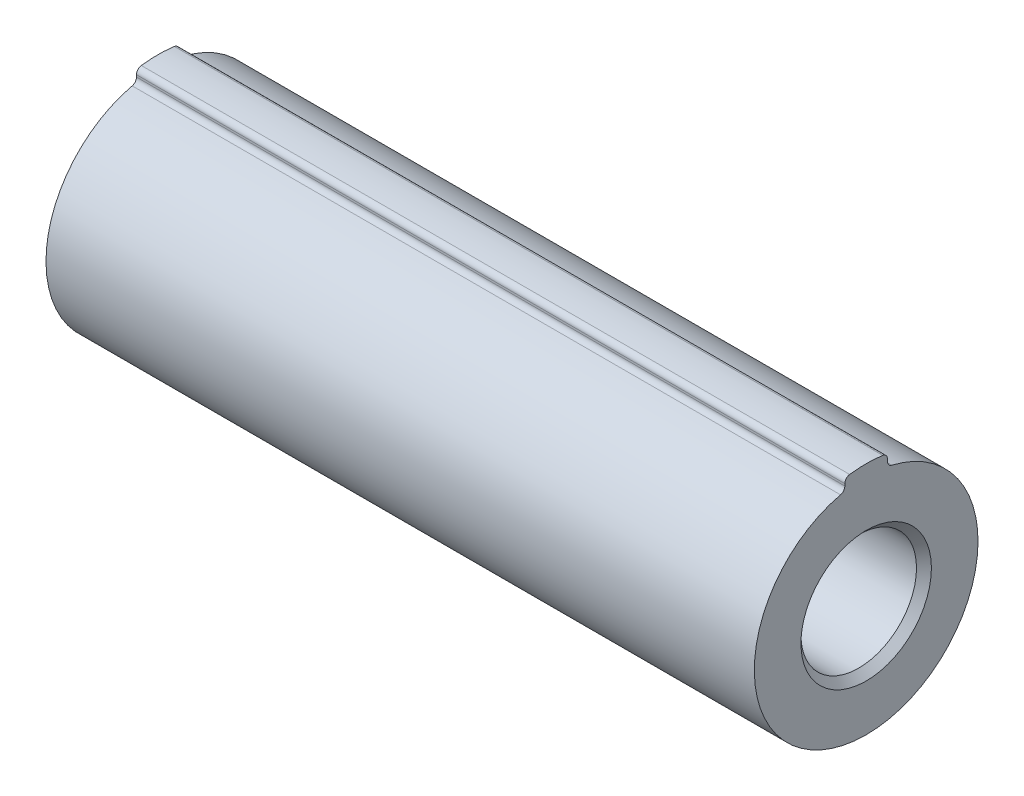
ISO-10303-21;
HEADER;
FILE_DESCRIPTION(('STEP AP214'),'2;1');
FILE_NAME('part.step','',(''),(''),'','','');
FILE_SCHEMA(('AUTOMOTIVE_DESIGN { 1 0 10303 214 1 1 1 1 }'));
ENDSEC;
DATA;
#1=APPLICATION_CONTEXT('core data for automotive mechanical design processes');
#2=APPLICATION_PROTOCOL_DEFINITION('international standard','automotive_design',2000,#1);
#3=PRODUCT_CONTEXT('',#1,'mechanical');
#4=PRODUCT('Part','Part','',(#3));
#5=PRODUCT_RELATED_PRODUCT_CATEGORY('part','',(#4));
#6=PRODUCT_DEFINITION_FORMATION('','',#4);
#7=PRODUCT_DEFINITION_CONTEXT('part definition',#1,'design');
#8=PRODUCT_DEFINITION('design','',#6,#7);
#9=PRODUCT_DEFINITION_SHAPE('','',#8);
#10=(LENGTH_UNIT() NAMED_UNIT(*) SI_UNIT(.MILLI.,.METRE.));
#11=(NAMED_UNIT(*) PLANE_ANGLE_UNIT() SI_UNIT($,.RADIAN.));
#12=(NAMED_UNIT(*) SI_UNIT($,.STERADIAN.) SOLID_ANGLE_UNIT());
#13=UNCERTAINTY_MEASURE_WITH_UNIT(LENGTH_MEASURE(1.E-05),#10,'distance_accuracy_value','');
#14=(GEOMETRIC_REPRESENTATION_CONTEXT(3) GLOBAL_UNCERTAINTY_ASSIGNED_CONTEXT((#13)) GLOBAL_UNIT_ASSIGNED_CONTEXT((#10,
#11,#12)) REPRESENTATION_CONTEXT('',''));
#15=CARTESIAN_POINT('',(0.,0.,0.));
#16=DIRECTION('',(0.,0.,1.));
#17=DIRECTION('',(1.,0.,0.));
#18=AXIS2_PLACEMENT_3D('',#15,#16,#17);
#19=CARTESIAN_POINT('',(0.,0.,0.));
#20=DIRECTION('',(-1.,0.,0.));
#21=DIRECTION('',(0.,0.,1.));
#22=AXIS2_PLACEMENT_3D('',#19,#20,#21);
#23=CYLINDRICAL_SURFACE('',#22,4.1);
#24=CARTESIAN_POINT('',(-19.6,0.,0.));
#25=DIRECTION('',(1.,0.,0.));
#26=DIRECTION('',(0.,0.,-1.));
#27=AXIS2_PLACEMENT_3D('',#24,#25,#26);
#28=CIRCLE('',#27,4.1);
#29=CARTESIAN_POINT('',(-19.6,4.,-0.899999999999999));
#30=VERTEX_POINT('',#29);
#31=CARTESIAN_POINT('',(-19.6,4.,0.899999999999999));
#32=VERTEX_POINT('',#31);
#33=EDGE_CURVE('E352',#30,#32,#28,.F.);
#34=ORIENTED_EDGE('',*,*,#33,.T.);
#35=DIRECTION('',(-1.,0.,0.));
#36=VECTOR('',#35,1.);
#37=CARTESIAN_POINT('',(0.,4.,0.899999999999999));
#38=LINE('',#37,#36);
#39=CARTESIAN_POINT('',(-14.945795243615,4.,0.9));
#40=VERTEX_POINT('',#39);
#41=EDGE_CURVE('E203',#32,#40,#38,.F.);
#42=ORIENTED_EDGE('',*,*,#41,.T.);
#43=CARTESIAN_POINT('',(-10.9,0.,0.));
#44=DIRECTION('',(-0.707106781186545,-0.705896069439704,-0.0413610825484487));
#45=DIRECTION('',(-0.70710678118655,0.7058960694397,0.0413610825484484));
#46=AXIS2_PLACEMENT_3D('',#43,#44,#45);
#47=ELLIPSE('',#46,5.79827560572971,4.1);
#48=CARTESIAN_POINT('',(-14.5,3.47906371590109,2.16935835230156));
#49=VERTEX_POINT('',#48);
#50=EDGE_CURVE('E367',#40,#49,#47,.F.);
#51=ORIENTED_EDGE('',*,*,#50,.T.);
#52=DIRECTION('',(1.,0.,0.));
#53=VECTOR('',#52,1.);
#54=CARTESIAN_POINT('',(-15.,3.47906371590109,2.16935835230156));
#55=LINE('',#54,#53);
#56=CARTESIAN_POINT('',(0.,3.47906371590109,2.16935835230156));
#57=VERTEX_POINT('',#56);
#58=EDGE_CURVE('E397',#49,#57,#55,.T.);
#59=ORIENTED_EDGE('',*,*,#58,.T.);
#60=CARTESIAN_POINT('',(0.,0.,0.));
#61=DIRECTION('',(-1.,0.,0.));
#62=DIRECTION('',(0.,0.,1.));
#63=AXIS2_PLACEMENT_3D('',#60,#61,#62);
#64=CIRCLE('',#63,4.1);
#65=CARTESIAN_POINT('',(0.,3.70860840829682,-1.74820584426152));
#66=VERTEX_POINT('',#65);
#67=EDGE_CURVE('E391',#66,#57,#64,.T.);
#68=ORIENTED_EDGE('',*,*,#67,.F.);
#69=DIRECTION('',(1.,0.,0.));
#70=VECTOR('',#69,1.);
#71=CARTESIAN_POINT('',(-15.,3.70860840829682,-1.74820584426152));
#72=LINE('',#71,#70);
#73=CARTESIAN_POINT('',(-14.5,3.70860840829682,-1.74820584426152));
#74=VERTEX_POINT('',#73);
#75=EDGE_CURVE('E389',#74,#66,#72,.T.);
#76=ORIENTED_EDGE('',*,*,#75,.F.);
#77=CARTESIAN_POINT('',(-10.9,0.,0.));
#78=DIRECTION('',(-0.707106781186545,-0.705896069439704,-0.0413610825484487));
#79=DIRECTION('',(-0.70710678118655,0.7058960694397,0.0413610825484484));
#80=AXIS2_PLACEMENT_3D('',#77,#78,#79);
#81=ELLIPSE('',#80,5.79827560572971,4.1);
#82=CARTESIAN_POINT('',(-14.8405071166049,4.,-0.899999999999999));
#83=VERTEX_POINT('',#82);
#84=EDGE_CURVE('E370',#74,#83,#81,.F.);
#85=ORIENTED_EDGE('',*,*,#84,.T.);
#86=DIRECTION('',(-1.,0.,0.));
#87=VECTOR('',#86,1.);
#88=CARTESIAN_POINT('',(0.,4.,-0.899999999999999));
#89=LINE('',#88,#87);
#90=EDGE_CURVE('E198',#83,#30,#89,.T.);
#91=ORIENTED_EDGE('',*,*,#90,.T.);
#92=EDGE_LOOP('',(#34,#42,#51,#59,#68,#76,#85,#91));
#93=FACE_BOUND('',#92,.T.);
#94=ADVANCED_FACE('F47',(#93),#23,.F.);
#95=CARTESIAN_POINT('',(0.,0.,0.));
#96=DIRECTION('',(-1.,0.,0.));
#97=DIRECTION('',(0.,0.,1.));
#98=AXIS2_PLACEMENT_3D('',#95,#96,#97);
#99=PLANE('',#98);
#100=ORIENTED_EDGE('',*,*,#67,.T.);
#101=DIRECTION('',(0.,-0.058493403894449,0.998287795027487));
#102=VECTOR('',#101,1.);
#103=CARTESIAN_POINT('',(0.,3.70860840829682,-1.74820584426152));
#104=LINE('',#103,#102);
#105=EDGE_CURVE('E220',#66,#57,#104,.T.);
#106=ORIENTED_EDGE('',*,*,#105,.F.);
#107=EDGE_LOOP('',(#100,#106));
#108=FACE_BOUND('',#107,.T.);
#109=ADVANCED_FACE('F433',(#108),#99,.T.);
#110=CARTESIAN_POINT('',(2.,0.,0.));
#111=DIRECTION('',(1.,0.,0.));
#112=DIRECTION('',(0.,0.,-1.));
#113=AXIS2_PLACEMENT_3D('',#110,#111,#112);
#114=CYLINDRICAL_SURFACE('',#113,3.1);
#115=CARTESIAN_POINT('',(17.6,0.,0.));
#116=DIRECTION('',(1.,0.,0.));
#117=DIRECTION('',(0.,0.,-1.));
#118=AXIS2_PLACEMENT_3D('',#115,#116,#117);
#119=CIRCLE('',#118,3.1);
#120=CARTESIAN_POINT('',(17.6,0.,-3.1));
#121=VERTEX_POINT('',#120);
#122=EDGE_CURVE('E417',#121,#121,#119,.T.);
#123=ORIENTED_EDGE('',*,*,#122,.T.);
#124=EDGE_LOOP('',(#123));
#125=FACE_BOUND('',#124,.T.);
#126=DIRECTION('',(-1.,0.,0.));
#127=VECTOR('',#126,1.);
#128=CARTESIAN_POINT('',(14.,2.6,1.68819430161341));
#129=LINE('',#128,#127);
#130=CARTESIAN_POINT('',(13.5,2.6,1.68819430161341));
#131=VERTEX_POINT('',#130);
#132=CARTESIAN_POINT('',(2.,2.6,1.68819430161341));
#133=VERTEX_POINT('',#132);
#134=EDGE_CURVE('E407',#131,#133,#129,.T.);
#135=ORIENTED_EDGE('',*,*,#134,.F.);
#136=CARTESIAN_POINT('',(10.9,0.,0.));
#137=DIRECTION('',(0.707106781186545,-0.70710678118655,0.));
#138=DIRECTION('',(0.70710678118655,0.707106781186545,0.));
#139=AXIS2_PLACEMENT_3D('',#136,#137,#138);
#140=ELLIPSE('',#139,4.38406204335661,3.1);
#141=CARTESIAN_POINT('',(14.,3.1,0.));
#142=VERTEX_POINT('',#141);
#143=EDGE_CURVE('E376',#131,#142,#140,.F.);
#144=ORIENTED_EDGE('',*,*,#143,.T.);
#145=CARTESIAN_POINT('',(10.9,0.,0.));
#146=DIRECTION('',(0.707106781186545,-0.70710678118655,0.));
#147=DIRECTION('',(0.70710678118655,0.707106781186545,0.));
#148=AXIS2_PLACEMENT_3D('',#145,#146,#147);
#149=ELLIPSE('',#148,4.38406204335661,3.1);
#150=CARTESIAN_POINT('',(13.5,2.6,-1.68819430161341));
#151=VERTEX_POINT('',#150);
#152=EDGE_CURVE('E374',#142,#151,#149,.F.);
#153=ORIENTED_EDGE('',*,*,#152,.T.);
#154=DIRECTION('',(-1.,0.,0.));
#155=VECTOR('',#154,1.);
#156=CARTESIAN_POINT('',(14.,2.6,-1.68819430161341));
#157=LINE('',#156,#155);
#158=CARTESIAN_POINT('',(2.,2.6,-1.68819430161341));
#159=VERTEX_POINT('',#158);
#160=EDGE_CURVE('E402',#151,#159,#157,.T.);
#161=ORIENTED_EDGE('',*,*,#160,.T.);
#162=CARTESIAN_POINT('',(2.,0.,0.));
#163=DIRECTION('',(1.,0.,0.));
#164=DIRECTION('',(0.,0.,-1.));
#165=AXIS2_PLACEMENT_3D('',#162,#163,#164);
#166=CIRCLE('',#165,3.1);
#167=EDGE_CURVE('E322',#133,#159,#166,.T.);
#168=ORIENTED_EDGE('',*,*,#167,.F.);
#169=EDGE_LOOP('',(#135,#144,#153,#161,#168));
#170=FACE_BOUND('',#169,.T.);
#171=ADVANCED_FACE('F430',(#125,#170),#114,.F.);
#172=CARTESIAN_POINT('',(2.,0.,0.));
#173=DIRECTION('',(1.,0.,0.));
#174=DIRECTION('',(0.,0.,-1.));
#175=AXIS2_PLACEMENT_3D('',#172,#173,#174);
#176=PLANE('',#175);
#177=ORIENTED_EDGE('',*,*,#167,.T.);
#178=DIRECTION('',(0.,0.,-1.));
#179=VECTOR('',#178,1.);
#180=CARTESIAN_POINT('',(2.,2.6,1.68819430161341));
#181=LINE('',#180,#179);
#182=EDGE_CURVE('E396',#133,#159,#181,.T.);
#183=ORIENTED_EDGE('',*,*,#182,.F.);
#184=EDGE_LOOP('',(#177,#183));
#185=FACE_BOUND('',#184,.T.);
#186=ADVANCED_FACE('F432',(#185),#176,.T.);
#187=CARTESIAN_POINT('',(-20.,0.,0.));
#188=DIRECTION('',(1.,0.,0.));
#189=DIRECTION('',(0.,0.,-1.));
#190=AXIS2_PLACEMENT_3D('',#187,#188,#189);
#191=CYLINDRICAL_SURFACE('',#190,6.);
#192=CARTESIAN_POINT('',(-20.,0.,0.));
#193=DIRECTION('',(1.,0.,0.));
#194=DIRECTION('',(0.,0.,-1.));
#195=AXIS2_PLACEMENT_3D('',#192,#193,#194);
#196=CIRCLE('',#195,6.);
#197=CARTESIAN_POINT('',(-20.,5.84014324455955,1.37576410878663));
#198=VERTEX_POINT('',#197);
#199=CARTESIAN_POINT('',(-20.,5.84014324455955,-1.37576410878663));
#200=VERTEX_POINT('',#199);
#201=EDGE_CURVE('E321',#198,#200,#196,.T.);
#202=ORIENTED_EDGE('',*,*,#201,.T.);
#203=DIRECTION('',(1.,0.,0.));
#204=VECTOR('',#203,1.);
#205=CARTESIAN_POINT('',(-20.,5.84014324455955,-1.37576410878663));
#206=LINE('',#205,#204);
#207=CARTESIAN_POINT('',(18.,5.84014324455955,-1.37576410878663));
#208=VERTEX_POINT('',#207);
#209=EDGE_CURVE('E288',#200,#208,#206,.T.);
#210=ORIENTED_EDGE('',*,*,#209,.T.);
#211=CARTESIAN_POINT('',(18.,0.,0.));
#212=DIRECTION('',(1.,0.,0.));
#213=DIRECTION('',(0.,0.,-1.));
#214=AXIS2_PLACEMENT_3D('',#211,#212,#213);
#215=CIRCLE('',#214,6.);
#216=CARTESIAN_POINT('',(18.,5.84014324455955,1.37576410878663));
#217=VERTEX_POINT('',#216);
#218=EDGE_CURVE('E310',#217,#208,#215,.T.);
#219=ORIENTED_EDGE('',*,*,#218,.F.);
#220=DIRECTION('',(1.,0.,0.));
#221=VECTOR('',#220,1.);
#222=CARTESIAN_POINT('',(-20.,5.84014324455955,1.37576410878663));
#223=LINE('',#222,#221);
#224=EDGE_CURVE('E285',#217,#198,#223,.F.);
#225=ORIENTED_EDGE('',*,*,#224,.T.);
#226=EDGE_LOOP('',(#202,#210,#219,#225));
#227=FACE_BOUND('',#226,.T.);
#228=ADVANCED_FACE('F318',(#227),#191,.T.);
#229=CARTESIAN_POINT('',(-20.,0.,0.));
#230=DIRECTION('',(1.,0.,0.));
#231=DIRECTION('',(0.,0.,-1.));
#232=AXIS2_PLACEMENT_3D('',#229,#230,#231);
#233=PLANE('',#232);
#234=CARTESIAN_POINT('',(-20.,0.,0.));
#235=DIRECTION('',(1.,0.,0.));
#236=DIRECTION('',(0.,0.,-1.));
#237=AXIS2_PLACEMENT_3D('',#234,#235,#236);
#238=CIRCLE('',#237,6.6);
#239=CARTESIAN_POINT('',(-20.,6.54042687104175,0.884769091093869));
#240=VERTEX_POINT('',#239);
#241=CARTESIAN_POINT('',(-20.,6.54042687104175,-0.884769091093869));
#242=VERTEX_POINT('',#241);
#243=EDGE_CURVE('E205',#240,#242,#238,.F.);
#244=ORIENTED_EDGE('',*,*,#243,.T.);
#245=CARTESIAN_POINT('',(-20.,6.24313474053985,-0.844552314225966));
#246=DIRECTION('',(1.,0.,0.));
#247=DIRECTION('',(0.,0.,-1.));
#248=AXIS2_PLACEMENT_3D('',#245,#246,#247);
#249=CIRCLE('',#248,0.3);
#250=CARTESIAN_POINT('',(-20.,6.24313474053985,-1.14455231422597));
#251=VERTEX_POINT('',#250);
#252=EDGE_CURVE('E282',#242,#251,#249,.F.);
#253=ORIENTED_EDGE('',*,*,#252,.T.);
#254=DIRECTION('',(0.,-1.,0.));
#255=VECTOR('',#254,1.);
#256=CARTESIAN_POINT('',(-20.,6.5,-1.14455231422597));
#257=LINE('',#256,#255);
#258=CARTESIAN_POINT('',(-20.,6.13215040678753,-1.14455231422597));
#259=VERTEX_POINT('',#258);
#260=EDGE_CURVE('E688',#251,#259,#257,.T.);
#261=ORIENTED_EDGE('',*,*,#260,.T.);
#262=CARTESIAN_POINT('',(-20.,6.13215040678753,-1.44455231422597));
#263=DIRECTION('',(1.,0.,0.));
#264=DIRECTION('',(0.,0.,-1.));
#265=AXIS2_PLACEMENT_3D('',#262,#263,#264);
#266=CIRCLE('',#265,0.3);
#267=EDGE_CURVE('E297',#259,#200,#266,.T.);
#268=ORIENTED_EDGE('',*,*,#267,.T.);
#269=ORIENTED_EDGE('',*,*,#201,.F.);
#270=CARTESIAN_POINT('',(-20.,6.13215040678753,1.44455231422597));
#271=DIRECTION('',(1.,0.,0.));
#272=DIRECTION('',(0.,0.,-1.));
#273=AXIS2_PLACEMENT_3D('',#270,#271,#272);
#274=CIRCLE('',#273,0.3);
#275=CARTESIAN_POINT('',(-20.,6.13215040678753,1.14455231422597));
#276=VERTEX_POINT('',#275);
#277=EDGE_CURVE('E11',#198,#276,#274,.T.);
#278=ORIENTED_EDGE('',*,*,#277,.T.);
#279=DIRECTION('',(0.,1.,0.));
#280=VECTOR('',#279,1.);
#281=CARTESIAN_POINT('',(-20.,6.5,1.14455231422597));
#282=LINE('',#281,#280);
#283=CARTESIAN_POINT('',(-20.,6.24313474053985,1.14455231422597));
#284=VERTEX_POINT('',#283);
#285=EDGE_CURVE('E199',#276,#284,#282,.T.);
#286=ORIENTED_EDGE('',*,*,#285,.T.);
#287=CARTESIAN_POINT('',(-20.,6.24313474053985,0.844552314225966));
#288=DIRECTION('',(1.,0.,0.));
#289=DIRECTION('',(0.,0.,-1.));
#290=AXIS2_PLACEMENT_3D('',#287,#288,#289);
#291=CIRCLE('',#290,0.3);
#292=EDGE_CURVE('E279',#284,#240,#291,.F.);
#293=ORIENTED_EDGE('',*,*,#292,.T.);
#294=EDGE_LOOP('',(#244,#253,#261,#268,#269,#278,#286,#293));
#295=FACE_BOUND('',#294,.T.);
#296=CARTESIAN_POINT('',(-20.,0.,0.));
#297=DIRECTION('',(1.,0.,0.));
#298=DIRECTION('',(0.,0.,-1.));
#299=AXIS2_PLACEMENT_3D('',#296,#297,#298);
#300=CIRCLE('',#299,4.49999999999999);
#301=CARTESIAN_POINT('',(-20.,4.35201102939778,1.14455231422597));
#302=VERTEX_POINT('',#301);
#303=CARTESIAN_POINT('',(-20.,4.35201102939778,-1.14455231422597));
#304=VERTEX_POINT('',#303);
#305=EDGE_CURVE('E348',#302,#304,#300,.T.);
#306=ORIENTED_EDGE('',*,*,#305,.T.);
#307=CARTESIAN_POINT('',(-20.,4.,-1.14455231422597));
#308=VERTEX_POINT('',#307);
#309=EDGE_CURVE('E177',#304,#308,#257,.T.);
#310=ORIENTED_EDGE('',*,*,#309,.T.);
#311=DIRECTION('',(0.,0.,1.));
#312=VECTOR('',#311,1.);
#313=CARTESIAN_POINT('',(-20.,4.,1.14455231422597));
#314=LINE('',#313,#312);
#315=CARTESIAN_POINT('',(-20.,4.,1.14455231422597));
#316=VERTEX_POINT('',#315);
#317=EDGE_CURVE('E170',#308,#316,#314,.T.);
#318=ORIENTED_EDGE('',*,*,#317,.T.);
#319=EDGE_CURVE('E175',#316,#302,#282,.T.);
#320=ORIENTED_EDGE('',*,*,#319,.T.);
#321=EDGE_LOOP('',(#306,#310,#318,#320));
#322=FACE_BOUND('',#321,.T.);
#323=ADVANCED_FACE('F173',(#295,#322),#233,.F.);
#324=CARTESIAN_POINT('',(18.,0.,0.));
#325=DIRECTION('',(1.,0.,0.));
#326=DIRECTION('',(0.,0.,-1.));
#327=AXIS2_PLACEMENT_3D('',#324,#325,#326);
#328=PLANE('',#327);
#329=DIRECTION('',(0.,1.,0.));
#330=VECTOR('',#329,1.);
#331=CARTESIAN_POINT('',(18.,6.5,-1.14455231422597));
#332=LINE('',#331,#330);
#333=CARTESIAN_POINT('',(18.,6.13215040678753,-1.14455231422597));
#334=VERTEX_POINT('',#333);
#335=CARTESIAN_POINT('',(18.,6.24313474053985,-1.14455231422597));
#336=VERTEX_POINT('',#335);
#337=EDGE_CURVE('E193',#334,#336,#332,.T.);
#338=ORIENTED_EDGE('',*,*,#337,.T.);
#339=CARTESIAN_POINT('',(18.,6.24313474053985,-0.844552314225966));
#340=DIRECTION('',(1.,0.,0.));
#341=DIRECTION('',(0.,0.,-1.));
#342=AXIS2_PLACEMENT_3D('',#339,#340,#341);
#343=CIRCLE('',#342,0.3);
#344=CARTESIAN_POINT('',(18.,6.54042687104175,-0.884769091093869));
#345=VERTEX_POINT('',#344);
#346=EDGE_CURVE('E269',#336,#345,#343,.T.);
#347=ORIENTED_EDGE('',*,*,#346,.T.);
#348=CARTESIAN_POINT('',(18.,0.,0.));
#349=DIRECTION('',(1.,0.,0.));
#350=DIRECTION('',(0.,0.,-1.));
#351=AXIS2_PLACEMENT_3D('',#348,#349,#350);
#352=CIRCLE('',#351,6.6);
#353=CARTESIAN_POINT('',(18.,6.54042687104175,0.884769091093869));
#354=VERTEX_POINT('',#353);
#355=EDGE_CURVE('E333',#345,#354,#352,.T.);
#356=ORIENTED_EDGE('',*,*,#355,.T.);
#357=CARTESIAN_POINT('',(18.,6.24313474053985,0.844552314225966));
#358=DIRECTION('',(1.,0.,0.));
#359=DIRECTION('',(0.,0.,-1.));
#360=AXIS2_PLACEMENT_3D('',#357,#358,#359);
#361=CIRCLE('',#360,0.3);
#362=CARTESIAN_POINT('',(18.,6.24313474053985,1.14455231422597));
#363=VERTEX_POINT('',#362);
#364=EDGE_CURVE('E266',#354,#363,#361,.T.);
#365=ORIENTED_EDGE('',*,*,#364,.T.);
#366=DIRECTION('',(0.,-1.,0.));
#367=VECTOR('',#366,1.);
#368=CARTESIAN_POINT('',(18.,6.5,1.14455231422597));
#369=LINE('',#368,#367);
#370=CARTESIAN_POINT('',(18.,6.13215040678753,1.14455231422597));
#371=VERTEX_POINT('',#370);
#372=EDGE_CURVE('E312',#363,#371,#369,.T.);
#373=ORIENTED_EDGE('',*,*,#372,.T.);
#374=CARTESIAN_POINT('',(18.,6.13215040678753,1.44455231422597));
#375=DIRECTION('',(1.,0.,0.));
#376=DIRECTION('',(0.,0.,-1.));
#377=AXIS2_PLACEMENT_3D('',#374,#375,#376);
#378=CIRCLE('',#377,0.3);
#379=EDGE_CURVE('E56',#371,#217,#378,.F.);
#380=ORIENTED_EDGE('',*,*,#379,.T.);
#381=ORIENTED_EDGE('',*,*,#218,.T.);
#382=CARTESIAN_POINT('',(18.,6.13215040678753,-1.44455231422597));
#383=DIRECTION('',(1.,0.,0.));
#384=DIRECTION('',(0.,0.,-1.));
#385=AXIS2_PLACEMENT_3D('',#382,#383,#384);
#386=CIRCLE('',#385,0.3);
#387=EDGE_CURVE('E300',#208,#334,#386,.F.);
#388=ORIENTED_EDGE('',*,*,#387,.T.);
#389=EDGE_LOOP('',(#338,#347,#356,#365,#373,#380,#381,#388));
#390=FACE_BOUND('',#389,.T.);
#391=CARTESIAN_POINT('',(18.,0.,0.));
#392=DIRECTION('',(1.,0.,0.));
#393=DIRECTION('',(0.,0.,-1.));
#394=AXIS2_PLACEMENT_3D('',#391,#392,#393);
#395=CIRCLE('',#394,3.5);
#396=CARTESIAN_POINT('',(18.,0.,-3.5));
#397=VERTEX_POINT('',#396);
#398=EDGE_CURVE('E360',#397,#397,#395,.F.);
#399=ORIENTED_EDGE('',*,*,#398,.T.);
#400=EDGE_LOOP('',(#399));
#401=FACE_BOUND('',#400,.T.);
#402=ADVANCED_FACE('F308',(#390,#401),#328,.T.);
#403=CARTESIAN_POINT('',(14.,2.6,1.68819430161341));
#404=DIRECTION('',(0.,1.,0.));
#405=DIRECTION('',(0.,0.,1.));
#406=AXIS2_PLACEMENT_3D('',#403,#404,#405);
#407=PLANE('',#406);
#408=ORIENTED_EDGE('',*,*,#160,.F.);
#409=DIRECTION('',(0.,0.,1.));
#410=VECTOR('',#409,1.);
#411=CARTESIAN_POINT('',(13.5,2.6,1.68819430161341));
#412=LINE('',#411,#410);
#413=EDGE_CURVE('E357',#151,#131,#412,.T.);
#414=ORIENTED_EDGE('',*,*,#413,.T.);
#415=ORIENTED_EDGE('',*,*,#134,.T.);
#416=ORIENTED_EDGE('',*,*,#182,.T.);
#417=EDGE_LOOP('',(#408,#414,#415,#416));
#418=FACE_BOUND('',#417,.T.);
#419=ADVANCED_FACE('F439',(#418),#407,.F.);
#420=CARTESIAN_POINT('',(-15.,3.70860840829682,-1.74820584426152));
#421=DIRECTION('',(0.,0.998287795027487,0.058493403894449));
#422=DIRECTION('',(0.,-0.058493403894449,0.998287795027487));
#423=AXIS2_PLACEMENT_3D('',#420,#421,#422);
#424=PLANE('',#423);
#425=ORIENTED_EDGE('',*,*,#58,.F.);
#426=DIRECTION('',(0.,0.058493403894449,-0.998287795027487));
#427=VECTOR('',#426,1.);
#428=CARTESIAN_POINT('',(-14.5,3.70860840829682,-1.74820584426152));
#429=LINE('',#428,#427);
#430=EDGE_CURVE('E351',#49,#74,#429,.T.);
#431=ORIENTED_EDGE('',*,*,#430,.T.);
#432=ORIENTED_EDGE('',*,*,#75,.T.);
#433=ORIENTED_EDGE('',*,*,#105,.T.);
#434=EDGE_LOOP('',(#425,#431,#432,#433));
#435=FACE_BOUND('',#434,.T.);
#436=ADVANCED_FACE('F427',(#435),#424,.F.);
#437=CARTESIAN_POINT('',(17.6,0.,0.));
#438=DIRECTION('',(1.,0.,0.));
#439=DIRECTION('',(0.,0.,-1.));
#440=AXIS2_PLACEMENT_3D('',#437,#438,#439);
#441=CONICAL_SURFACE('',#440,3.1,0.785398163397451);
#442=ORIENTED_EDGE('',*,*,#398,.F.);
#443=EDGE_LOOP('',(#442));
#444=FACE_BOUND('',#443,.T.);
#445=ORIENTED_EDGE('',*,*,#122,.F.);
#446=EDGE_LOOP('',(#445));
#447=FACE_BOUND('',#446,.T.);
#448=ADVANCED_FACE('F424',(#444,#447),#441,.F.);
#449=CARTESIAN_POINT('',(-19.6,0.,0.));
#450=DIRECTION('',(-1.,0.,0.));
#451=DIRECTION('',(0.,0.,1.));
#452=AXIS2_PLACEMENT_3D('',#449,#450,#451);
#453=CONICAL_SURFACE('',#452,4.1,0.785398163397444);
#454=CARTESIAN_POINT('',(-20.6405124237433,5.01147363343945,-1.14455231422597));
#455=CARTESIAN_POINT('',(-20.5070795220239,4.87459578546291,-1.14455231422597));
#456=CARTESIAN_POINT('',(-20.3737761685693,4.73759125717982,-1.14455231422597));
#457=CARTESIAN_POINT('',(-20.1075314047229,4.46323442896393,-1.14455231422597));
#458=CARTESIAN_POINT('',(-19.9745899897538,4.32588213347213,-1.14455231422597));
#459=CARTESIAN_POINT('',(-19.7091677040425,4.05073100578329,-1.14455231422597));
#460=CARTESIAN_POINT('',(-19.5766868362533,3.91293217073402,-1.14455231422597));
#461=CARTESIAN_POINT('',(-19.3123681208664,3.63671604170466,-1.14455231422597));
#462=CARTESIAN_POINT('',(-19.180530281567,3.49829873978714,-1.14455231422597));
#463=CARTESIAN_POINT('',(-19.0491064755827,3.35948757625673,-1.14455231422597));
#464=B_SPLINE_CURVE_WITH_KNOTS('',3,(#454,#455,#456,#457,#458,#459,#460,#461,#462,#463),
.UNSPECIFIED.,.F.,.F.,(4,2,2,2,4),(0.,0.573462549690817,1.14691781279785,1.72037674603828,
2.29384306034205),.UNSPECIFIED.);
#465=CARTESIAN_POINT('',(-19.660528812543,4.,-1.14455231422597));
#466=VERTEX_POINT('',#465);
#467=EDGE_CURVE('E248',#304,#466,#464,.T.);
#468=ORIENTED_EDGE('',*,*,#467,.F.);
#469=ORIENTED_EDGE('',*,*,#305,.F.);
#470=CARTESIAN_POINT('',(-19.0491064755827,3.35948757625673,1.14455231422597));
#471=CARTESIAN_POINT('',(-19.180530281567,3.49829873978714,1.14455231422597));
#472=CARTESIAN_POINT('',(-19.3123681208664,3.63671604170466,1.14455231422597));
#473=CARTESIAN_POINT('',(-19.5766868362533,3.91293217073402,1.14455231422597));
#474=CARTESIAN_POINT('',(-19.7091677040425,4.05073100578329,1.14455231422597));
#475=CARTESIAN_POINT('',(-19.9745899897538,4.32588213347213,1.14455231422597));
#476=CARTESIAN_POINT('',(-20.1075314047229,4.46323442896393,1.14455231422597));
#477=CARTESIAN_POINT('',(-20.3737761685693,4.73759125717982,1.14455231422597));
#478=CARTESIAN_POINT('',(-20.5070795220239,4.87459578546292,1.14455231422597));
#479=CARTESIAN_POINT('',(-20.6405124237433,5.01147363343945,1.14455231422597));
#480=B_SPLINE_CURVE_WITH_KNOTS('',3,(#470,#471,#472,#473,#474,#475,#476,#477,#478,#479),
.UNSPECIFIED.,.F.,.F.,(4,2,2,2,4),(0.,0.573466314303781,1.14692524754421,1.72038051065124,
2.29384306034206),.UNSPECIFIED.);
#481=CARTESIAN_POINT('',(-19.660528812543,4.,1.14455231422597));
#482=VERTEX_POINT('',#481);
#483=EDGE_CURVE('E196',#482,#302,#480,.T.);
#484=ORIENTED_EDGE('',*,*,#483,.F.);
#485=CARTESIAN_POINT('',(-19.6607214354292,4.,-1.14525231422597));
#486=CARTESIAN_POINT('',(-19.6331286611804,4.,-1.04512074827041));
#487=CARTESIAN_POINT('',(-19.6086847685509,4.,-0.944074837029873));
#488=CARTESIAN_POINT('',(-19.5667474553669,4.,-0.740470191763186));
#489=CARTESIAN_POINT('',(-19.5492598094205,4.,-0.637910273845009));
#490=CARTESIAN_POINT('',(-19.5222128103074,4.,-0.433851835244523));
#491=CARTESIAN_POINT('',(-19.5124998097253,4.,-0.332373993257924));
#492=CARTESIAN_POINT('',(-19.500794109144,4.,-0.129014606971468));
#493=CARTESIAN_POINT('',(-19.4987978501336,4.,-0.0271332704746154));
#494=CARTESIAN_POINT('',(-19.5023684766593,4.,0.164279973288215));
#495=CARTESIAN_POINT('',(-19.5070581730344,4.,0.253829520379924));
#496=CARTESIAN_POINT('',(-19.5223240057192,4.,0.432448975574252));
#497=CARTESIAN_POINT('',(-19.5329017864019,4.,0.521518742669007));
#498=CARTESIAN_POINT('',(-19.5598815210282,4.,0.700423973175525));
#499=CARTESIAN_POINT('',(-19.5763862354557,4.,0.790243748226297));
#500=CARTESIAN_POINT('',(-19.6146973522168,4.,0.96869067329294));
#501=CARTESIAN_POINT('',(-19.636500425227,4.,1.05731853550541));
#502=CARTESIAN_POINT('',(-19.6607214354292,4.,1.14525231422597));
#503=B_SPLINE_CURVE_WITH_KNOTS('',3,(#485,#486,#487,#488,#489,#490,#491,#492,#493,#494,#495,
#496,#497,#498,#499,#500,#501,#502),.UNSPECIFIED.,.F.,.F.,(4,2,2,2,2,2,2,2,4),(0.,
0.31160829527333,0.623474729646387,0.929014182918096,1.23441270258936,1.50323418552548,
1.77213078028083,2.04593436130407,2.31956633556059),.UNSPECIFIED.);
#504=EDGE_CURVE('E189',#32,#482,#503,.T.);
#505=ORIENTED_EDGE('',*,*,#504,.F.);
#506=ORIENTED_EDGE('',*,*,#33,.F.);
#507=EDGE_CURVE('E219',#466,#30,#503,.T.);
#508=ORIENTED_EDGE('',*,*,#507,.F.);
#509=EDGE_LOOP('',(#468,#469,#484,#505,#506,#508));
#510=FACE_BOUND('',#509,.T.);
#511=ADVANCED_FACE('F223',(#510),#453,.F.);
#512=CARTESIAN_POINT('',(-15.,4.09297995961269,0.239822955967241));
#513=DIRECTION('',(-0.707106781186545,-0.705896069439704,-0.0413610825484487));
#514=DIRECTION('',(0.,0.058493403894449,-0.998287795027487));
#515=AXIS2_PLACEMENT_3D('',#512,#513,#514);
#516=PLANE('',#515);
#517=DIRECTION('',(-0.0583935929911421,0.,0.99829363831369));
#518=VECTOR('',#517,1.);
#519=CARTESIAN_POINT('',(-14.9074957424463,4.,0.245233844866286));
#520=LINE('',#519,#518);
#521=EDGE_CURVE('E249',#83,#40,#520,.T.);
#522=ORIENTED_EDGE('',*,*,#521,.F.);
#523=ORIENTED_EDGE('',*,*,#84,.F.);
#524=ORIENTED_EDGE('',*,*,#430,.F.);
#525=ORIENTED_EDGE('',*,*,#50,.F.);
#526=EDGE_LOOP('',(#522,#523,#524,#525));
#527=FACE_BOUND('',#526,.T.);
#528=ADVANCED_FACE('F384',(#527),#516,.T.);
#529=CARTESIAN_POINT('',(14.,3.1,0.));
#530=DIRECTION('',(0.707106781186545,-0.70710678118655,0.));
#531=DIRECTION('',(0.,0.,1.));
#532=AXIS2_PLACEMENT_3D('',#529,#530,#531);
#533=PLANE('',#532);
#534=ORIENTED_EDGE('',*,*,#143,.F.);
#535=ORIENTED_EDGE('',*,*,#413,.F.);
#536=ORIENTED_EDGE('',*,*,#152,.F.);
#537=EDGE_LOOP('',(#534,#535,#536));
#538=FACE_BOUND('',#537,.T.);
#539=ADVANCED_FACE('F231',(#538),#533,.T.);
#540=CARTESIAN_POINT('',(-23.4641016151378,4.,1.14455231422597));
#541=DIRECTION('',(0.,-1.,0.));
#542=DIRECTION('',(0.,0.,-1.));
#543=AXIS2_PLACEMENT_3D('',#540,#541,#542);
#544=PLANE('',#543);
#545=DIRECTION('',(1.,0.,0.));
#546=VECTOR('',#545,1.);
#547=CARTESIAN_POINT('',(-23.4641016151378,4.,-1.14455231422597));
#548=LINE('',#547,#546);
#549=EDGE_CURVE('E182',#308,#466,#548,.T.);
#550=ORIENTED_EDGE('',*,*,#549,.T.);
#551=ORIENTED_EDGE('',*,*,#507,.T.);
#552=ORIENTED_EDGE('',*,*,#90,.F.);
#553=ORIENTED_EDGE('',*,*,#521,.T.);
#554=ORIENTED_EDGE('',*,*,#41,.F.);
#555=ORIENTED_EDGE('',*,*,#504,.T.);
#556=DIRECTION('',(1.,0.,0.));
#557=VECTOR('',#556,1.);
#558=CARTESIAN_POINT('',(-23.4641016151378,4.,1.14455231422597));
#559=LINE('',#558,#557);
#560=EDGE_CURVE('E186',#316,#482,#559,.T.);
#561=ORIENTED_EDGE('',*,*,#560,.F.);
#562=ORIENTED_EDGE('',*,*,#317,.F.);
#563=EDGE_LOOP('',(#550,#551,#552,#553,#554,#555,#561,#562));
#564=FACE_BOUND('',#563,.T.);
#565=ADVANCED_FACE('F187',(#564),#544,.T.);
#566=CARTESIAN_POINT('',(-23.4641016151378,6.5,1.14455231422597));
#567=DIRECTION('',(0.,0.,1.));
#568=DIRECTION('',(0.,-1.,0.));
#569=AXIS2_PLACEMENT_3D('',#566,#567,#568);
#570=PLANE('',#569);
#571=ORIENTED_EDGE('',*,*,#560,.T.);
#572=ORIENTED_EDGE('',*,*,#483,.T.);
#573=ORIENTED_EDGE('',*,*,#319,.F.);
#574=EDGE_LOOP('',(#571,#572,#573));
#575=FACE_BOUND('',#574,.T.);
#576=ADVANCED_FACE('F195',(#575),#570,.T.);
#577=CARTESIAN_POINT('',(-23.4641016151378,6.5,-1.14455231422597));
#578=DIRECTION('',(0.,0.,-1.));
#579=DIRECTION('',(0.,1.,0.));
#580=AXIS2_PLACEMENT_3D('',#577,#578,#579);
#581=PLANE('',#580);
#582=ORIENTED_EDGE('',*,*,#309,.F.);
#583=ORIENTED_EDGE('',*,*,#467,.T.);
#584=ORIENTED_EDGE('',*,*,#549,.F.);
#585=EDGE_LOOP('',(#582,#583,#584));
#586=FACE_BOUND('',#585,.T.);
#587=ADVANCED_FACE('F232',(#586),#581,.T.);
#588=ORIENTED_EDGE('',*,*,#260,.F.);
#589=DIRECTION('',(1.,0.,0.));
#590=VECTOR('',#589,1.);
#591=CARTESIAN_POINT('',(-23.4641016151378,6.24313474053985,-1.14455231422597));
#592=LINE('',#591,#590);
#593=EDGE_CURVE('E262',#251,#336,#592,.T.);
#594=ORIENTED_EDGE('',*,*,#593,.T.);
#595=ORIENTED_EDGE('',*,*,#337,.F.);
#596=DIRECTION('',(-1.,0.,0.));
#597=VECTOR('',#596,1.);
#598=CARTESIAN_POINT('',(-20.,6.13215040678753,-1.14455231422597));
#599=LINE('',#598,#597);
#600=EDGE_CURVE('E258',#334,#259,#599,.T.);
#601=ORIENTED_EDGE('',*,*,#600,.T.);
#602=EDGE_LOOP('',(#588,#594,#595,#601));
#603=FACE_BOUND('',#602,.T.);
#604=ADVANCED_FACE('F522',(#603),#581,.T.);
#605=ORIENTED_EDGE('',*,*,#372,.F.);
#606=DIRECTION('',(1.,0.,0.));
#607=VECTOR('',#606,1.);
#608=CARTESIAN_POINT('',(-23.4641016151378,6.24313474053985,1.14455231422597));
#609=LINE('',#608,#607);
#610=EDGE_CURVE('E63',#363,#284,#609,.F.);
#611=ORIENTED_EDGE('',*,*,#610,.T.);
#612=ORIENTED_EDGE('',*,*,#285,.F.);
#613=DIRECTION('',(-1.,0.,0.));
#614=VECTOR('',#613,1.);
#615=CARTESIAN_POINT('',(18.,6.13215040678753,1.14455231422597));
#616=LINE('',#615,#614);
#617=EDGE_CURVE('E291',#276,#371,#616,.F.);
#618=ORIENTED_EDGE('',*,*,#617,.T.);
#619=EDGE_LOOP('',(#605,#611,#612,#618));
#620=FACE_BOUND('',#619,.T.);
#621=ADVANCED_FACE('F237',(#620),#570,.T.);
#622=CARTESIAN_POINT('',(-23.4641016151378,0.,0.));
#623=DIRECTION('',(1.,0.,0.));
#624=DIRECTION('',(0.,0.,-1.));
#625=AXIS2_PLACEMENT_3D('',#622,#623,#624);
#626=CYLINDRICAL_SURFACE('',#625,6.6);
#627=ORIENTED_EDGE('',*,*,#355,.F.);
#628=DIRECTION('',(1.,0.,0.));
#629=VECTOR('',#628,1.);
#630=CARTESIAN_POINT('',(-23.4641016151378,6.54042687104175,-0.884769091093869));
#631=LINE('',#630,#629);
#632=EDGE_CURVE('E276',#345,#242,#631,.F.);
#633=ORIENTED_EDGE('',*,*,#632,.T.);
#634=ORIENTED_EDGE('',*,*,#243,.F.);
#635=DIRECTION('',(1.,0.,0.));
#636=VECTOR('',#635,1.);
#637=CARTESIAN_POINT('',(-23.4641016151378,6.54042687104175,0.884769091093869));
#638=LINE('',#637,#636);
#639=EDGE_CURVE('E272',#240,#354,#638,.T.);
#640=ORIENTED_EDGE('',*,*,#639,.T.);
#641=EDGE_LOOP('',(#627,#633,#634,#640));
#642=FACE_BOUND('',#641,.T.);
#643=ADVANCED_FACE('F238',(#642),#626,.T.);
#644=CARTESIAN_POINT('',(-23.4641016151378,6.24313474053985,-0.844552314225966));
#645=DIRECTION('',(1.,0.,0.));
#646=DIRECTION('',(0.,0.,-1.));
#647=AXIS2_PLACEMENT_3D('',#644,#645,#646);
#648=CYLINDRICAL_SURFACE('',#647,0.3);
#649=ORIENTED_EDGE('',*,*,#252,.F.);
#650=ORIENTED_EDGE('',*,*,#632,.F.);
#651=ORIENTED_EDGE('',*,*,#346,.F.);
#652=ORIENTED_EDGE('',*,*,#593,.F.);
#653=EDGE_LOOP('',(#649,#650,#651,#652));
#654=FACE_BOUND('',#653,.T.);
#655=ADVANCED_FACE('F538',(#654),#648,.T.);
#656=CARTESIAN_POINT('',(-20.,6.13215040678753,-1.44455231422597));
#657=DIRECTION('',(1.,0.,0.));
#658=DIRECTION('',(0.,0.,-1.));
#659=AXIS2_PLACEMENT_3D('',#656,#657,#658);
#660=CYLINDRICAL_SURFACE('',#659,0.3);
#661=ORIENTED_EDGE('',*,*,#387,.F.);
#662=ORIENTED_EDGE('',*,*,#209,.F.);
#663=ORIENTED_EDGE('',*,*,#267,.F.);
#664=ORIENTED_EDGE('',*,*,#600,.F.);
#665=EDGE_LOOP('',(#661,#662,#663,#664));
#666=FACE_BOUND('',#665,.T.);
#667=ADVANCED_FACE('F544',(#666),#660,.F.);
#668=CARTESIAN_POINT('',(-23.4641016151378,6.24313474053985,0.844552314225966));
#669=DIRECTION('',(1.,0.,0.));
#670=DIRECTION('',(0.,0.,-1.));
#671=AXIS2_PLACEMENT_3D('',#668,#669,#670);
#672=CYLINDRICAL_SURFACE('',#671,0.3);
#673=ORIENTED_EDGE('',*,*,#292,.F.);
#674=ORIENTED_EDGE('',*,*,#610,.F.);
#675=ORIENTED_EDGE('',*,*,#364,.F.);
#676=ORIENTED_EDGE('',*,*,#639,.F.);
#677=EDGE_LOOP('',(#673,#674,#675,#676));
#678=FACE_BOUND('',#677,.T.);
#679=ADVANCED_FACE('F329',(#678),#672,.T.);
#680=CARTESIAN_POINT('',(-20.,6.13215040678753,1.44455231422597));
#681=DIRECTION('',(1.,0.,0.));
#682=DIRECTION('',(0.,0.,-1.));
#683=AXIS2_PLACEMENT_3D('',#680,#681,#682);
#684=CYLINDRICAL_SURFACE('',#683,0.3);
#685=ORIENTED_EDGE('',*,*,#277,.F.);
#686=ORIENTED_EDGE('',*,*,#224,.F.);
#687=ORIENTED_EDGE('',*,*,#379,.F.);
#688=ORIENTED_EDGE('',*,*,#617,.F.);
#689=EDGE_LOOP('',(#685,#686,#687,#688));
#690=FACE_BOUND('',#689,.T.);
#691=ADVANCED_FACE('F49',(#690),#684,.F.);
#692=CLOSED_SHELL('',(#94,#109,#171,#186,#228,#323,#402,#419,#436,#448,#511,#528,#539,#565,#576,
#587,#604,#621,#643,#655,#667,#679,#691));
#693=MANIFOLD_SOLID_BREP('B2',#692);
#694=ADVANCED_BREP_SHAPE_REPRESENTATION('',(#18,#693),#14);
#695=SHAPE_DEFINITION_REPRESENTATION(#9,#694);
ENDSEC;
END-ISO-10303-21;
